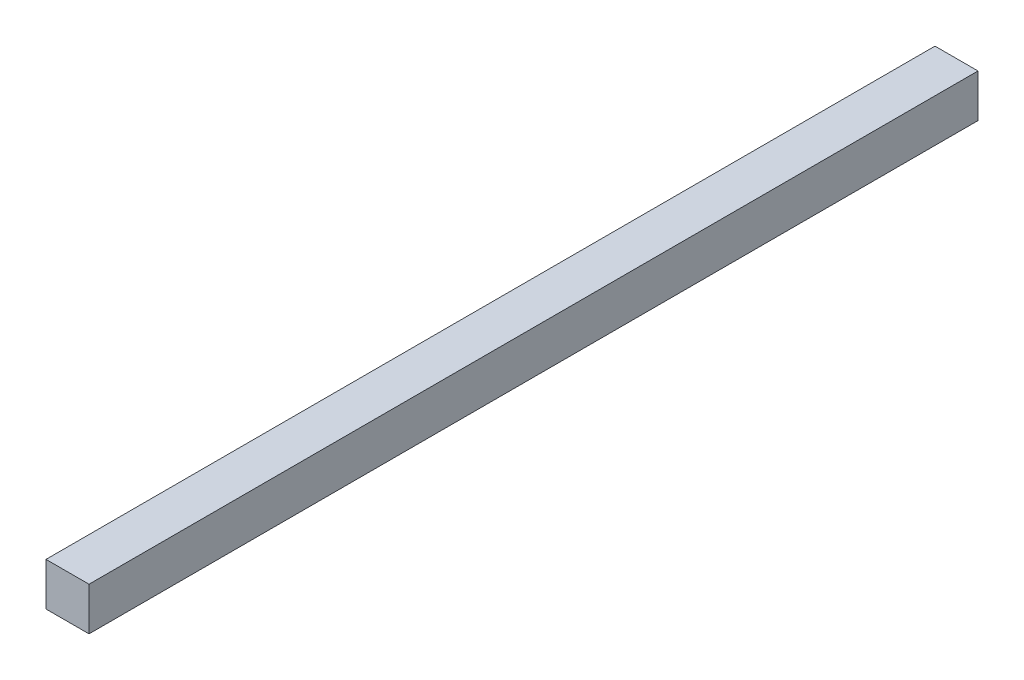
ISO-10303-21;
HEADER;
FILE_DESCRIPTION(('STEP AP214'),'2;1');
FILE_NAME('part.step','',(''),(''),'','','');
FILE_SCHEMA(('AUTOMOTIVE_DESIGN { 1 0 10303 214 1 1 1 1 }'));
ENDSEC;
DATA;
#1=APPLICATION_CONTEXT('core data for automotive mechanical design processes');
#2=APPLICATION_PROTOCOL_DEFINITION('international standard','automotive_design',2000,#1);
#3=PRODUCT_CONTEXT('',#1,'mechanical');
#4=PRODUCT('Part','Part','',(#3));
#5=PRODUCT_RELATED_PRODUCT_CATEGORY('part','',(#4));
#6=PRODUCT_DEFINITION_FORMATION('','',#4);
#7=PRODUCT_DEFINITION_CONTEXT('part definition',#1,'design');
#8=PRODUCT_DEFINITION('design','',#6,#7);
#9=PRODUCT_DEFINITION_SHAPE('','',#8);
#10=(LENGTH_UNIT() NAMED_UNIT(*) SI_UNIT(.MILLI.,.METRE.));
#11=(NAMED_UNIT(*) PLANE_ANGLE_UNIT() SI_UNIT($,.RADIAN.));
#12=(NAMED_UNIT(*) SI_UNIT($,.STERADIAN.) SOLID_ANGLE_UNIT());
#13=UNCERTAINTY_MEASURE_WITH_UNIT(LENGTH_MEASURE(1.E-05),#10,'distance_accuracy_value','');
#14=(GEOMETRIC_REPRESENTATION_CONTEXT(3) GLOBAL_UNCERTAINTY_ASSIGNED_CONTEXT((#13)) GLOBAL_UNIT_ASSIGNED_CONTEXT((#10,
#11,#12)) REPRESENTATION_CONTEXT('',''));
#15=CARTESIAN_POINT('',(0.,0.,0.));
#16=DIRECTION('',(0.,0.,1.));
#17=DIRECTION('',(1.,0.,0.));
#18=AXIS2_PLACEMENT_3D('',#15,#16,#17);
#19=CARTESIAN_POINT('',(-12.2596153846154,28.4855769230769,310.));
#20=DIRECTION('',(1.,0.,0.));
#21=DIRECTION('',(0.,0.,-1.));
#22=AXIS2_PLACEMENT_3D('',#19,#20,#21);
#23=PLANE('',#22);
#24=DIRECTION('',(0.,-1.,0.));
#25=VECTOR('',#24,1.);
#26=CARTESIAN_POINT('',(-12.2596153846154,28.4855769230769,0.));
#27=LINE('',#26,#25);
#28=CARTESIAN_POINT('',(-12.2596153846154,43.4855769230769,0.));
#29=VERTEX_POINT('',#28);
#30=CARTESIAN_POINT('',(-12.2596153846154,28.4855769230769,0.));
#31=VERTEX_POINT('',#30);
#32=EDGE_CURVE('E97',#29,#31,#27,.T.);
#33=ORIENTED_EDGE('',*,*,#32,.T.);
#34=DIRECTION('',(0.,0.,-1.));
#35=VECTOR('',#34,1.);
#36=CARTESIAN_POINT('',(-12.2596153846154,28.4855769230769,310.));
#37=LINE('',#36,#35);
#38=CARTESIAN_POINT('',(-12.2596153846154,28.4855769230769,310.));
#39=VERTEX_POINT('',#38);
#40=EDGE_CURVE('E11',#39,#31,#37,.T.);
#41=ORIENTED_EDGE('',*,*,#40,.F.);
#42=DIRECTION('',(0.,-1.,0.));
#43=VECTOR('',#42,1.);
#44=CARTESIAN_POINT('',(-12.2596153846154,28.4855769230769,310.));
#45=LINE('',#44,#43);
#46=CARTESIAN_POINT('',(-12.2596153846154,43.4855769230769,310.));
#47=VERTEX_POINT('',#46);
#48=EDGE_CURVE('E85',#47,#39,#45,.T.);
#49=ORIENTED_EDGE('',*,*,#48,.F.);
#50=DIRECTION('',(0.,0.,-1.));
#51=VECTOR('',#50,1.);
#52=CARTESIAN_POINT('',(-12.2596153846154,43.4855769230769,310.));
#53=LINE('',#52,#51);
#54=EDGE_CURVE('E93',#47,#29,#53,.T.);
#55=ORIENTED_EDGE('',*,*,#54,.T.);
#56=EDGE_LOOP('',(#33,#41,#49,#55));
#57=FACE_BOUND('',#56,.T.);
#58=ADVANCED_FACE('F34',(#57),#23,.F.);
#59=CARTESIAN_POINT('',(-12.2596153846154,28.4855769230769,310.));
#60=DIRECTION('',(0.,1.,0.));
#61=DIRECTION('',(0.,0.,1.));
#62=AXIS2_PLACEMENT_3D('',#59,#60,#61);
#63=PLANE('',#62);
#64=DIRECTION('',(1.,0.,0.));
#65=VECTOR('',#64,1.);
#66=CARTESIAN_POINT('',(-12.2596153846154,28.4855769230769,0.));
#67=LINE('',#66,#65);
#68=CARTESIAN_POINT('',(2.74038461538459,28.4855769230769,0.));
#69=VERTEX_POINT('',#68);
#70=EDGE_CURVE('E89',#31,#69,#67,.T.);
#71=ORIENTED_EDGE('',*,*,#70,.T.);
#72=DIRECTION('',(0.,0.,-1.));
#73=VECTOR('',#72,1.);
#74=CARTESIAN_POINT('',(2.74038461538459,28.4855769230769,310.));
#75=LINE('',#74,#73);
#76=CARTESIAN_POINT('',(2.74038461538459,28.4855769230769,310.));
#77=VERTEX_POINT('',#76);
#78=EDGE_CURVE('E42',#77,#69,#75,.T.);
#79=ORIENTED_EDGE('',*,*,#78,.F.);
#80=DIRECTION('',(1.,0.,0.));
#81=VECTOR('',#80,1.);
#82=CARTESIAN_POINT('',(-12.2596153846154,28.4855769230769,310.));
#83=LINE('',#82,#81);
#84=EDGE_CURVE('E80',#39,#77,#83,.T.);
#85=ORIENTED_EDGE('',*,*,#84,.F.);
#86=ORIENTED_EDGE('',*,*,#40,.T.);
#87=EDGE_LOOP('',(#71,#79,#85,#86));
#88=FACE_BOUND('',#87,.T.);
#89=ADVANCED_FACE('F88',(#88),#63,.F.);
#90=CARTESIAN_POINT('',(2.74038461538459,28.4855769230769,310.));
#91=DIRECTION('',(-1.,0.,0.));
#92=DIRECTION('',(0.,0.,1.));
#93=AXIS2_PLACEMENT_3D('',#90,#91,#92);
#94=PLANE('',#93);
#95=DIRECTION('',(0.,1.,0.));
#96=VECTOR('',#95,1.);
#97=CARTESIAN_POINT('',(2.74038461538459,28.4855769230769,0.));
#98=LINE('',#97,#96);
#99=CARTESIAN_POINT('',(2.74038461538459,43.4855769230769,0.));
#100=VERTEX_POINT('',#99);
#101=EDGE_CURVE('E67',#69,#100,#98,.T.);
#102=ORIENTED_EDGE('',*,*,#101,.T.);
#103=DIRECTION('',(0.,0.,-1.));
#104=VECTOR('',#103,1.);
#105=CARTESIAN_POINT('',(2.74038461538459,43.4855769230769,310.));
#106=LINE('',#105,#104);
#107=CARTESIAN_POINT('',(2.74038461538459,43.4855769230769,310.));
#108=VERTEX_POINT('',#107);
#109=EDGE_CURVE('E90',#108,#100,#106,.T.);
#110=ORIENTED_EDGE('',*,*,#109,.F.);
#111=DIRECTION('',(0.,1.,0.));
#112=VECTOR('',#111,1.);
#113=CARTESIAN_POINT('',(2.74038461538459,28.4855769230769,310.));
#114=LINE('',#113,#112);
#115=EDGE_CURVE('E83',#77,#108,#114,.T.);
#116=ORIENTED_EDGE('',*,*,#115,.F.);
#117=ORIENTED_EDGE('',*,*,#78,.T.);
#118=EDGE_LOOP('',(#102,#110,#116,#117));
#119=FACE_BOUND('',#118,.T.);
#120=ADVANCED_FACE('F91',(#119),#94,.F.);
#121=CARTESIAN_POINT('',(-12.2596153846154,43.4855769230769,310.));
#122=DIRECTION('',(0.,-1.,0.));
#123=DIRECTION('',(0.,0.,-1.));
#124=AXIS2_PLACEMENT_3D('',#121,#122,#123);
#125=PLANE('',#124);
#126=DIRECTION('',(-1.,0.,0.));
#127=VECTOR('',#126,1.);
#128=CARTESIAN_POINT('',(-12.2596153846154,43.4855769230769,0.));
#129=LINE('',#128,#127);
#130=EDGE_CURVE('E73',#100,#29,#129,.T.);
#131=ORIENTED_EDGE('',*,*,#130,.T.);
#132=ORIENTED_EDGE('',*,*,#54,.F.);
#133=DIRECTION('',(-1.,0.,0.));
#134=VECTOR('',#133,1.);
#135=CARTESIAN_POINT('',(-12.2596153846154,43.4855769230769,310.));
#136=LINE('',#135,#134);
#137=EDGE_CURVE('E50',#108,#47,#136,.T.);
#138=ORIENTED_EDGE('',*,*,#137,.F.);
#139=ORIENTED_EDGE('',*,*,#109,.T.);
#140=EDGE_LOOP('',(#131,#132,#138,#139));
#141=FACE_BOUND('',#140,.T.);
#142=ADVANCED_FACE('F104',(#141),#125,.F.);
#143=CARTESIAN_POINT('',(0.,0.,310.));
#144=DIRECTION('',(0.,0.,-1.));
#145=DIRECTION('',(-1.,0.,0.));
#146=AXIS2_PLACEMENT_3D('',#143,#144,#145);
#147=PLANE('',#146);
#148=ORIENTED_EDGE('',*,*,#48,.T.);
#149=ORIENTED_EDGE('',*,*,#84,.T.);
#150=ORIENTED_EDGE('',*,*,#115,.T.);
#151=ORIENTED_EDGE('',*,*,#137,.T.);
#152=EDGE_LOOP('',(#148,#149,#150,#151));
#153=FACE_BOUND('',#152,.T.);
#154=ADVANCED_FACE('F81',(#153),#147,.F.);
#155=CARTESIAN_POINT('',(0.,0.,0.));
#156=DIRECTION('',(0.,0.,-1.));
#157=DIRECTION('',(-1.,0.,0.));
#158=AXIS2_PLACEMENT_3D('',#155,#156,#157);
#159=PLANE('',#158);
#160=ORIENTED_EDGE('',*,*,#32,.F.);
#161=ORIENTED_EDGE('',*,*,#130,.F.);
#162=ORIENTED_EDGE('',*,*,#101,.F.);
#163=ORIENTED_EDGE('',*,*,#70,.F.);
#164=EDGE_LOOP('',(#160,#161,#162,#163));
#165=FACE_BOUND('',#164,.T.);
#166=ADVANCED_FACE('F107',(#165),#159,.T.);
#167=CLOSED_SHELL('',(#58,#89,#120,#142,#154,#166));
#168=MANIFOLD_SOLID_BREP('B2',#167);
#169=ADVANCED_BREP_SHAPE_REPRESENTATION('',(#18,#168),#14);
#170=SHAPE_DEFINITION_REPRESENTATION(#9,#169);
ENDSEC;
END-ISO-10303-21;
